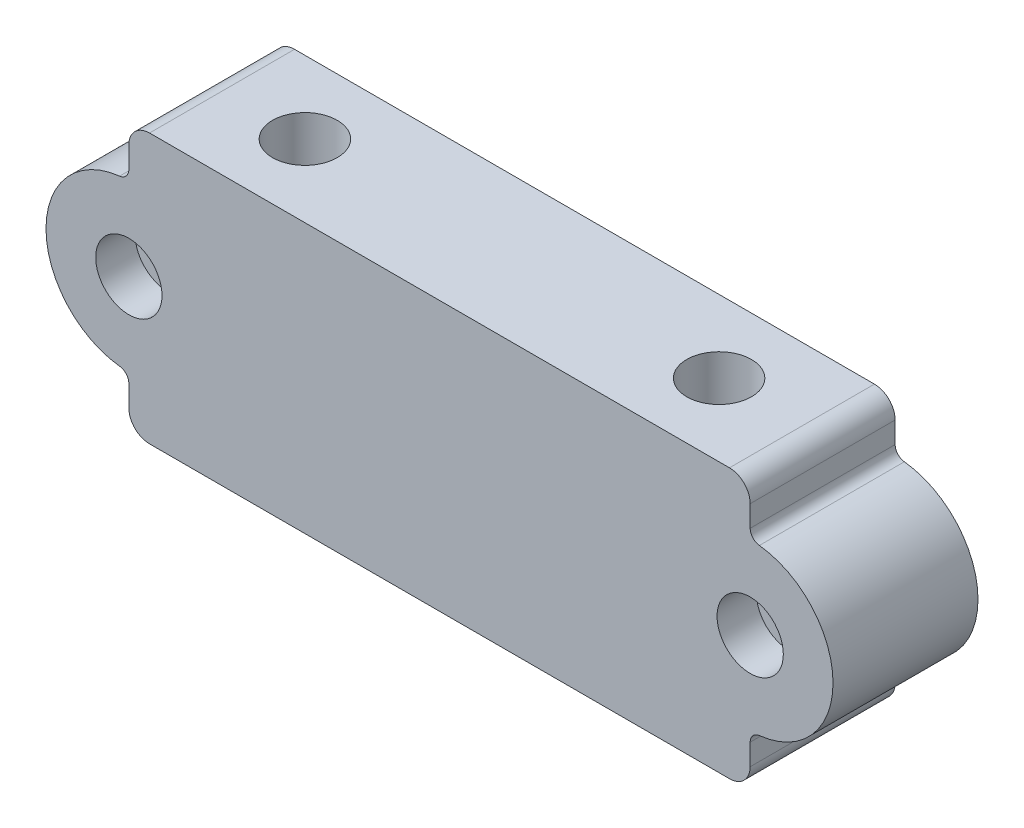
ISO-10303-21;
HEADER;
FILE_DESCRIPTION(('STEP AP214'),'2;1');
FILE_NAME('part.step','',(''),(''),'','','');
FILE_SCHEMA(('AUTOMOTIVE_DESIGN { 1 0 10303 214 1 1 1 1 }'));
ENDSEC;
DATA;
#1=APPLICATION_CONTEXT('core data for automotive mechanical design processes');
#2=APPLICATION_PROTOCOL_DEFINITION('international standard','automotive_design',2000,#1);
#3=PRODUCT_CONTEXT('',#1,'mechanical');
#4=PRODUCT('Part','Part','',(#3));
#5=PRODUCT_RELATED_PRODUCT_CATEGORY('part','',(#4));
#6=PRODUCT_DEFINITION_FORMATION('','',#4);
#7=PRODUCT_DEFINITION_CONTEXT('part definition',#1,'design');
#8=PRODUCT_DEFINITION('design','',#6,#7);
#9=PRODUCT_DEFINITION_SHAPE('','',#8);
#10=(LENGTH_UNIT() NAMED_UNIT(*) SI_UNIT(.MILLI.,.METRE.));
#11=(NAMED_UNIT(*) PLANE_ANGLE_UNIT() SI_UNIT($,.RADIAN.));
#12=(NAMED_UNIT(*) SI_UNIT($,.STERADIAN.) SOLID_ANGLE_UNIT());
#13=UNCERTAINTY_MEASURE_WITH_UNIT(LENGTH_MEASURE(1.E-05),#10,'distance_accuracy_value','');
#14=(GEOMETRIC_REPRESENTATION_CONTEXT(3) GLOBAL_UNCERTAINTY_ASSIGNED_CONTEXT((#13)) GLOBAL_UNIT_ASSIGNED_CONTEXT((#10,
#11,#12)) REPRESENTATION_CONTEXT('',''));
#15=CARTESIAN_POINT('',(0.,0.,0.));
#16=DIRECTION('',(0.,0.,1.));
#17=DIRECTION('',(1.,0.,0.));
#18=AXIS2_PLACEMENT_3D('',#15,#16,#17);
#19=CARTESIAN_POINT('',(101.6,-33.02,0.));
#20=DIRECTION('',(0.,0.,1.));
#21=DIRECTION('',(1.,0.,0.));
#22=AXIS2_PLACEMENT_3D('',#19,#20,#21);
#23=PLANE('',#22);
#24=CARTESIAN_POINT('',(88.9,-16.51,0.));
#25=DIRECTION('',(0.,0.,1.));
#26=DIRECTION('',(1.,0.,0.));
#27=AXIS2_PLACEMENT_3D('',#24,#25,#26);
#28=CIRCLE('',#27,4.064);
#29=CARTESIAN_POINT('',(92.964,-16.51,0.));
#30=VERTEX_POINT('',#29);
#31=EDGE_CURVE('E276',#30,#30,#28,.T.);
#32=ORIENTED_EDGE('',*,*,#31,.F.);
#33=EDGE_LOOP('',(#32));
#34=FACE_BOUND('',#33,.T.);
#35=CARTESIAN_POINT('',(12.7,-16.51,0.));
#36=DIRECTION('',(0.,0.,1.));
#37=DIRECTION('',(1.,0.,0.));
#38=AXIS2_PLACEMENT_3D('',#35,#36,#37);
#39=CIRCLE('',#38,4.064);
#40=CARTESIAN_POINT('',(16.764,-16.51,0.));
#41=VERTEX_POINT('',#40);
#42=EDGE_CURVE('E215',#41,#41,#39,.T.);
#43=ORIENTED_EDGE('',*,*,#42,.F.);
#44=EDGE_LOOP('',(#43));
#45=FACE_BOUND('',#44,.T.);
#46=DIRECTION('',(1.,0.,0.));
#47=VECTOR('',#46,1.);
#48=CARTESIAN_POINT('',(101.6,0.,0.));
#49=LINE('',#48,#47);
#50=CARTESIAN_POINT('',(15.24,0.,0.));
#51=VERTEX_POINT('',#50);
#52=CARTESIAN_POINT('',(86.36,0.,0.));
#53=VERTEX_POINT('',#52);
#54=EDGE_CURVE('E317',#51,#53,#49,.T.);
#55=ORIENTED_EDGE('',*,*,#54,.F.);
#56=CARTESIAN_POINT('',(15.24,-2.54,0.));
#57=DIRECTION('',(0.,0.,1.));
#58=DIRECTION('',(1.,0.,0.));
#59=AXIS2_PLACEMENT_3D('',#56,#57,#58);
#60=CIRCLE('',#59,2.54);
#61=CARTESIAN_POINT('',(12.7,-2.54,0.));
#62=VERTEX_POINT('',#61);
#63=EDGE_CURVE('E349',#51,#62,#60,.T.);
#64=ORIENTED_EDGE('',*,*,#63,.T.);
#65=DIRECTION('',(0.,1.,0.));
#66=VECTOR('',#65,1.);
#67=CARTESIAN_POINT('',(12.7,-5.15077467430091,0.));
#68=LINE('',#67,#66);
#69=CARTESIAN_POINT('',(12.7,-5.15077467430091,0.));
#70=VERTEX_POINT('',#69);
#71=EDGE_CURVE('E202',#70,#62,#68,.T.);
#72=ORIENTED_EDGE('',*,*,#71,.F.);
#73=CARTESIAN_POINT('',(11.43,-5.15077467430094,0.));
#74=DIRECTION('',(0.,0.,1.));
#75=DIRECTION('',(-1.,0.,0.));
#76=AXIS2_PLACEMENT_3D('',#73,#74,#75);
#77=CIRCLE('',#76,1.26999999999998);
#78=CARTESIAN_POINT('',(11.5711111111111,-6.41291082160079,0.));
#79=VERTEX_POINT('',#78);
#80=EDGE_CURVE('E165',#79,#70,#77,.T.);
#81=ORIENTED_EDGE('',*,*,#80,.F.);
#82=CARTESIAN_POINT('',(12.7,-16.5099999999999,0.));
#83=DIRECTION('',(0.,0.,-1.));
#84=DIRECTION('',(-1.,0.,0.));
#85=AXIS2_PLACEMENT_3D('',#82,#83,#84);
#86=CIRCLE('',#85,10.1600000000001);
#87=CARTESIAN_POINT('',(11.5711111111111,-26.607089178399,0.));
#88=VERTEX_POINT('',#87);
#89=EDGE_CURVE('E186',#88,#79,#86,.T.);
#90=ORIENTED_EDGE('',*,*,#89,.F.);
#91=CARTESIAN_POINT('',(11.43,-27.8692253256989,0.));
#92=DIRECTION('',(0.,0.,1.));
#93=DIRECTION('',(1.,0.,0.));
#94=AXIS2_PLACEMENT_3D('',#91,#92,#93);
#95=CIRCLE('',#94,1.27);
#96=CARTESIAN_POINT('',(12.7,-27.8692253256989,0.));
#97=VERTEX_POINT('',#96);
#98=EDGE_CURVE('E190',#97,#88,#95,.T.);
#99=ORIENTED_EDGE('',*,*,#98,.F.);
#100=DIRECTION('',(0.,1.,0.));
#101=VECTOR('',#100,1.);
#102=CARTESIAN_POINT('',(12.7,-27.8692253256989,0.));
#103=LINE('',#102,#101);
#104=CARTESIAN_POINT('',(12.7,-30.48,0.));
#105=VERTEX_POINT('',#104);
#106=EDGE_CURVE('E206',#105,#97,#103,.T.);
#107=ORIENTED_EDGE('',*,*,#106,.F.);
#108=CARTESIAN_POINT('',(15.24,-30.48,0.));
#109=DIRECTION('',(0.,0.,1.));
#110=DIRECTION('',(1.,0.,0.));
#111=AXIS2_PLACEMENT_3D('',#108,#109,#110);
#112=CIRCLE('',#111,2.54);
#113=CARTESIAN_POINT('',(15.24,-33.02,0.));
#114=VERTEX_POINT('',#113);
#115=EDGE_CURVE('E340',#105,#114,#112,.T.);
#116=ORIENTED_EDGE('',*,*,#115,.T.);
#117=DIRECTION('',(1.,0.,0.));
#118=VECTOR('',#117,1.);
#119=CARTESIAN_POINT('',(101.6,-33.02,0.));
#120=LINE('',#119,#118);
#121=CARTESIAN_POINT('',(86.36,-33.02,0.));
#122=VERTEX_POINT('',#121);
#123=EDGE_CURVE('E316',#114,#122,#120,.T.);
#124=ORIENTED_EDGE('',*,*,#123,.T.);
#125=CARTESIAN_POINT('',(86.36,-30.48,0.));
#126=DIRECTION('',(0.,0.,1.));
#127=DIRECTION('',(1.,0.,0.));
#128=AXIS2_PLACEMENT_3D('',#125,#126,#127);
#129=CIRCLE('',#128,2.54);
#130=CARTESIAN_POINT('',(88.9,-30.48,2.66050878019847E-13));
#131=VERTEX_POINT('',#130);
#132=EDGE_CURVE('E343',#122,#131,#129,.T.);
#133=ORIENTED_EDGE('',*,*,#132,.T.);
#134=DIRECTION('',(0.,-1.,0.));
#135=VECTOR('',#134,1.);
#136=CARTESIAN_POINT('',(88.9,-27.8692253256989,2.66050878019847E-13));
#137=LINE('',#136,#135);
#138=CARTESIAN_POINT('',(88.9,-27.8692253256989,2.66050878019847E-13));
#139=VERTEX_POINT('',#138);
#140=EDGE_CURVE('E254',#139,#131,#137,.T.);
#141=ORIENTED_EDGE('',*,*,#140,.F.);
#142=CARTESIAN_POINT('',(90.17,-27.8692253256989,2.74919240620508E-13));
#143=DIRECTION('',(0.,0.,1.));
#144=DIRECTION('',(-1.,0.,0.));
#145=AXIS2_PLACEMENT_3D('',#142,#143,#144);
#146=CIRCLE('',#145,1.27);
#147=CARTESIAN_POINT('',(90.0288888888889,-26.607089178399,2.73933866998212E-13));
#148=VERTEX_POINT('',#147);
#149=EDGE_CURVE('E250',#148,#139,#146,.T.);
#150=ORIENTED_EDGE('',*,*,#149,.F.);
#151=CARTESIAN_POINT('',(88.9,-16.5099999999999,2.66050878019847E-13));
#152=DIRECTION('',(0.,0.,-1.));
#153=DIRECTION('',(1.,0.,0.));
#154=AXIS2_PLACEMENT_3D('',#151,#152,#153);
#155=CIRCLE('',#154,10.1600000000001);
#156=CARTESIAN_POINT('',(90.0288888888889,-6.41291082160078,2.73933866998212E-13));
#157=VERTEX_POINT('',#156);
#158=EDGE_CURVE('E246',#157,#148,#155,.T.);
#159=ORIENTED_EDGE('',*,*,#158,.F.);
#160=CARTESIAN_POINT('',(90.17,-5.15077467430092,2.74919240620508E-13));
#161=DIRECTION('',(0.,0.,1.));
#162=DIRECTION('',(1.,0.,0.));
#163=AXIS2_PLACEMENT_3D('',#160,#161,#162);
#164=CIRCLE('',#163,1.26999999999998);
#165=CARTESIAN_POINT('',(88.9,-5.1507746743009,2.66050878019847E-13));
#166=VERTEX_POINT('',#165);
#167=EDGE_CURVE('E242',#166,#157,#164,.T.);
#168=ORIENTED_EDGE('',*,*,#167,.F.);
#169=DIRECTION('',(0.,-1.,0.));
#170=VECTOR('',#169,1.);
#171=CARTESIAN_POINT('',(88.9,-5.1507746743009,2.66050878019847E-13));
#172=LINE('',#171,#170);
#173=CARTESIAN_POINT('',(88.9,-2.54,2.66050878019847E-13));
#174=VERTEX_POINT('',#173);
#175=EDGE_CURVE('E227',#174,#166,#172,.T.);
#176=ORIENTED_EDGE('',*,*,#175,.F.);
#177=CARTESIAN_POINT('',(86.36,-2.54,0.));
#178=DIRECTION('',(0.,0.,1.));
#179=DIRECTION('',(1.,0.,0.));
#180=AXIS2_PLACEMENT_3D('',#177,#178,#179);
#181=CIRCLE('',#180,2.54);
#182=EDGE_CURVE('E346',#174,#53,#181,.T.);
#183=ORIENTED_EDGE('',*,*,#182,.T.);
#184=EDGE_LOOP('',(#55,#64,#72,#81,#90,#99,#107,#116,#124,#133,#141,#150,#159,#168,#176,#183));
#185=FACE_BOUND('',#184,.T.);
#186=ADVANCED_FACE('F42',(#34,#45,#185),#23,.T.);
#187=CARTESIAN_POINT('',(101.6,-33.02,-17.78));
#188=DIRECTION('',(0.,0.,-1.));
#189=DIRECTION('',(-1.,0.,0.));
#190=AXIS2_PLACEMENT_3D('',#187,#188,#189);
#191=PLANE('',#190);
#192=CARTESIAN_POINT('',(88.9,-16.51,-17.78));
#193=DIRECTION('',(0.,0.,-1.));
#194=DIRECTION('',(-1.,0.,0.));
#195=AXIS2_PLACEMENT_3D('',#192,#193,#194);
#196=CIRCLE('',#195,2.4892);
#197=CARTESIAN_POINT('',(86.4108,-16.51,-17.78));
#198=VERTEX_POINT('',#197);
#199=EDGE_CURVE('E287',#198,#198,#196,.F.);
#200=ORIENTED_EDGE('',*,*,#199,.T.);
#201=EDGE_LOOP('',(#200));
#202=FACE_BOUND('',#201,.T.);
#203=CARTESIAN_POINT('',(12.7,-16.51,-17.78));
#204=DIRECTION('',(0.,0.,-1.));
#205=DIRECTION('',(-1.,0.,0.));
#206=AXIS2_PLACEMENT_3D('',#203,#204,#205);
#207=CIRCLE('',#206,2.4892);
#208=CARTESIAN_POINT('',(10.2108,-16.51,-17.78));
#209=VERTEX_POINT('',#208);
#210=EDGE_CURVE('E292',#209,#209,#207,.F.);
#211=ORIENTED_EDGE('',*,*,#210,.T.);
#212=EDGE_LOOP('',(#211));
#213=FACE_BOUND('',#212,.T.);
#214=DIRECTION('',(0.,1.,0.));
#215=VECTOR('',#214,1.);
#216=CARTESIAN_POINT('',(12.7,-5.15077467430091,-17.78));
#217=LINE('',#216,#215);
#218=CARTESIAN_POINT('',(12.7,-5.15077467430091,-17.78));
#219=VERTEX_POINT('',#218);
#220=CARTESIAN_POINT('',(12.7,-2.54,-17.78));
#221=VERTEX_POINT('',#220);
#222=EDGE_CURVE('E174',#219,#221,#217,.T.);
#223=ORIENTED_EDGE('',*,*,#222,.T.);
#224=CARTESIAN_POINT('',(15.24,-2.54,-17.78));
#225=DIRECTION('',(0.,0.,-1.));
#226=DIRECTION('',(-1.,0.,0.));
#227=AXIS2_PLACEMENT_3D('',#224,#225,#226);
#228=CIRCLE('',#227,2.54);
#229=CARTESIAN_POINT('',(15.24,0.,-17.78));
#230=VERTEX_POINT('',#229);
#231=EDGE_CURVE('E362',#221,#230,#228,.T.);
#232=ORIENTED_EDGE('',*,*,#231,.T.);
#233=DIRECTION('',(-1.,0.,0.));
#234=VECTOR('',#233,1.);
#235=CARTESIAN_POINT('',(101.6,0.,-17.78));
#236=LINE('',#235,#234);
#237=CARTESIAN_POINT('',(86.36,0.,-17.78));
#238=VERTEX_POINT('',#237);
#239=EDGE_CURVE('E309',#238,#230,#236,.T.);
#240=ORIENTED_EDGE('',*,*,#239,.F.);
#241=CARTESIAN_POINT('',(86.36,-2.54,-17.78));
#242=DIRECTION('',(0.,0.,-1.));
#243=DIRECTION('',(-1.,0.,0.));
#244=AXIS2_PLACEMENT_3D('',#241,#242,#243);
#245=CIRCLE('',#244,2.54);
#246=CARTESIAN_POINT('',(88.9,-2.54,-17.7799999999997));
#247=VERTEX_POINT('',#246);
#248=EDGE_CURVE('E359',#238,#247,#245,.T.);
#249=ORIENTED_EDGE('',*,*,#248,.T.);
#250=DIRECTION('',(0.,-1.,0.));
#251=VECTOR('',#250,1.);
#252=CARTESIAN_POINT('',(88.9,-5.1507746743009,-17.7799999999997));
#253=LINE('',#252,#251);
#254=CARTESIAN_POINT('',(88.9,-5.1507746743009,-17.7799999999997));
#255=VERTEX_POINT('',#254);
#256=EDGE_CURVE('E238',#247,#255,#253,.T.);
#257=ORIENTED_EDGE('',*,*,#256,.T.);
#258=CARTESIAN_POINT('',(90.17,-5.15077467430092,-17.7799999999997));
#259=DIRECTION('',(0.,0.,1.));
#260=DIRECTION('',(1.,0.,0.));
#261=AXIS2_PLACEMENT_3D('',#258,#259,#260);
#262=CIRCLE('',#261,1.26999999999998);
#263=CARTESIAN_POINT('',(90.0288888888889,-6.41291082160078,-17.7799999999997));
#264=VERTEX_POINT('',#263);
#265=EDGE_CURVE('E222',#255,#264,#262,.T.);
#266=ORIENTED_EDGE('',*,*,#265,.T.);
#267=CARTESIAN_POINT('',(88.9,-16.5099999999999,-17.7799999999997));
#268=DIRECTION('',(0.,0.,-1.));
#269=DIRECTION('',(1.,0.,0.));
#270=AXIS2_PLACEMENT_3D('',#267,#268,#269);
#271=CIRCLE('',#270,10.1600000000001);
#272=CARTESIAN_POINT('',(90.0288888888889,-26.607089178399,-17.7799999999997));
#273=VERTEX_POINT('',#272);
#274=EDGE_CURVE('E226',#264,#273,#271,.T.);
#275=ORIENTED_EDGE('',*,*,#274,.T.);
#276=CARTESIAN_POINT('',(90.17,-27.8692253256989,-17.7799999999997));
#277=DIRECTION('',(0.,0.,1.));
#278=DIRECTION('',(-1.,0.,0.));
#279=AXIS2_PLACEMENT_3D('',#276,#277,#278);
#280=CIRCLE('',#279,1.27);
#281=CARTESIAN_POINT('',(88.9,-27.8692253256989,-17.7799999999997));
#282=VERTEX_POINT('',#281);
#283=EDGE_CURVE('E231',#273,#282,#280,.T.);
#284=ORIENTED_EDGE('',*,*,#283,.T.);
#285=DIRECTION('',(0.,-1.,0.));
#286=VECTOR('',#285,1.);
#287=CARTESIAN_POINT('',(88.9,-27.8692253256989,-17.7799999999997));
#288=LINE('',#287,#286);
#289=CARTESIAN_POINT('',(88.9,-30.48,-17.7799999999997));
#290=VERTEX_POINT('',#289);
#291=EDGE_CURVE('E235',#282,#290,#288,.T.);
#292=ORIENTED_EDGE('',*,*,#291,.T.);
#293=CARTESIAN_POINT('',(86.36,-30.48,-17.78));
#294=DIRECTION('',(0.,0.,-1.));
#295=DIRECTION('',(-1.,0.,0.));
#296=AXIS2_PLACEMENT_3D('',#293,#294,#295);
#297=CIRCLE('',#296,2.54);
#298=CARTESIAN_POINT('',(86.36,-33.02,-17.78));
#299=VERTEX_POINT('',#298);
#300=EDGE_CURVE('E65',#290,#299,#297,.T.);
#301=ORIENTED_EDGE('',*,*,#300,.T.);
#302=DIRECTION('',(-1.,0.,0.));
#303=VECTOR('',#302,1.);
#304=CARTESIAN_POINT('',(101.6,-33.02,-17.78));
#305=LINE('',#304,#303);
#306=CARTESIAN_POINT('',(15.24,-33.02,-17.78));
#307=VERTEX_POINT('',#306);
#308=EDGE_CURVE('E313',#299,#307,#305,.T.);
#309=ORIENTED_EDGE('',*,*,#308,.T.);
#310=CARTESIAN_POINT('',(15.24,-30.48,-17.78));
#311=DIRECTION('',(0.,0.,-1.));
#312=DIRECTION('',(-1.,0.,0.));
#313=AXIS2_PLACEMENT_3D('',#310,#311,#312);
#314=CIRCLE('',#313,2.54);
#315=CARTESIAN_POINT('',(12.7,-30.48,-17.78));
#316=VERTEX_POINT('',#315);
#317=EDGE_CURVE('E354',#307,#316,#314,.T.);
#318=ORIENTED_EDGE('',*,*,#317,.T.);
#319=DIRECTION('',(0.,1.,0.));
#320=VECTOR('',#319,1.);
#321=CARTESIAN_POINT('',(12.7,-27.8692253256989,-17.78));
#322=LINE('',#321,#320);
#323=CARTESIAN_POINT('',(12.7,-27.8692253256989,-17.78));
#324=VERTEX_POINT('',#323);
#325=EDGE_CURVE('E180',#316,#324,#322,.T.);
#326=ORIENTED_EDGE('',*,*,#325,.T.);
#327=CARTESIAN_POINT('',(11.43,-27.8692253256989,-17.78));
#328=DIRECTION('',(0.,0.,1.));
#329=DIRECTION('',(1.,0.,0.));
#330=AXIS2_PLACEMENT_3D('',#327,#328,#329);
#331=CIRCLE('',#330,1.27);
#332=CARTESIAN_POINT('',(11.5711111111111,-26.607089178399,-17.78));
#333=VERTEX_POINT('',#332);
#334=EDGE_CURVE('E195',#324,#333,#331,.T.);
#335=ORIENTED_EDGE('',*,*,#334,.T.);
#336=CARTESIAN_POINT('',(12.7,-16.5099999999999,-17.78));
#337=DIRECTION('',(0.,0.,-1.));
#338=DIRECTION('',(-1.,0.,0.));
#339=AXIS2_PLACEMENT_3D('',#336,#337,#338);
#340=CIRCLE('',#339,10.1600000000001);
#341=CARTESIAN_POINT('',(11.5711111111111,-6.41291082160079,-17.78));
#342=VERTEX_POINT('',#341);
#343=EDGE_CURVE('E171',#333,#342,#340,.T.);
#344=ORIENTED_EDGE('',*,*,#343,.T.);
#345=CARTESIAN_POINT('',(11.43,-5.15077467430094,-17.78));
#346=DIRECTION('',(0.,0.,1.));
#347=DIRECTION('',(-1.,0.,0.));
#348=AXIS2_PLACEMENT_3D('',#345,#346,#347);
#349=CIRCLE('',#348,1.26999999999998);
#350=EDGE_CURVE('E162',#342,#219,#349,.T.);
#351=ORIENTED_EDGE('',*,*,#350,.T.);
#352=EDGE_LOOP('',(#223,#232,#240,#249,#257,#266,#275,#284,#292,#301,#309,#318,#326,#335,#344,#351));
#353=FACE_BOUND('',#352,.T.);
#354=ADVANCED_FACE('F182',(#202,#213,#353),#191,.T.);
#355=CARTESIAN_POINT('',(12.7,-16.51,-24.8205207989182));
#356=DIRECTION('',(0.,0.,1.));
#357=DIRECTION('',(1.,0.,0.));
#358=AXIS2_PLACEMENT_3D('',#355,#356,#357);
#359=CYLINDRICAL_SURFACE('',#358,2.4892);
#360=ORIENTED_EDGE('',*,*,#210,.F.);
#361=EDGE_LOOP('',(#360));
#362=FACE_BOUND('',#361,.T.);
#363=CARTESIAN_POINT('',(12.7,-16.51,-4.826));
#364=DIRECTION('',(0.,0.,1.));
#365=DIRECTION('',(1.,0.,0.));
#366=AXIS2_PLACEMENT_3D('',#363,#364,#365);
#367=CIRCLE('',#366,2.4892);
#368=CARTESIAN_POINT('',(15.1892,-16.51,-4.826));
#369=VERTEX_POINT('',#368);
#370=EDGE_CURVE('E296',#369,#369,#367,.F.);
#371=ORIENTED_EDGE('',*,*,#370,.F.);
#372=EDGE_LOOP('',(#371));
#373=FACE_BOUND('',#372,.T.);
#374=ADVANCED_FACE('F444',(#362,#373),#359,.F.);
#375=CARTESIAN_POINT('',(88.9,-16.51,-24.8205207989182));
#376=DIRECTION('',(0.,0.,1.));
#377=DIRECTION('',(1.,0.,0.));
#378=AXIS2_PLACEMENT_3D('',#375,#376,#377);
#379=CYLINDRICAL_SURFACE('',#378,2.4892);
#380=ORIENTED_EDGE('',*,*,#199,.F.);
#381=EDGE_LOOP('',(#380));
#382=FACE_BOUND('',#381,.T.);
#383=CARTESIAN_POINT('',(88.9,-16.51,-4.826));
#384=DIRECTION('',(0.,0.,1.));
#385=DIRECTION('',(1.,0.,0.));
#386=AXIS2_PLACEMENT_3D('',#383,#384,#385);
#387=CIRCLE('',#386,2.4892);
#388=CARTESIAN_POINT('',(91.3892,-16.51,-4.826));
#389=VERTEX_POINT('',#388);
#390=EDGE_CURVE('E275',#389,#389,#387,.F.);
#391=ORIENTED_EDGE('',*,*,#390,.F.);
#392=EDGE_LOOP('',(#391));
#393=FACE_BOUND('',#392,.T.);
#394=ADVANCED_FACE('F533',(#382,#393),#379,.F.);
#395=CARTESIAN_POINT('',(0.,-33.02,0.));
#396=DIRECTION('',(0.,-1.,0.));
#397=DIRECTION('',(0.,0.,-1.));
#398=AXIS2_PLACEMENT_3D('',#395,#396,#397);
#399=PLANE('',#398);
#400=ORIENTED_EDGE('',*,*,#308,.F.);
#401=DIRECTION('',(0.,0.,1.));
#402=VECTOR('',#401,1.);
#403=CARTESIAN_POINT('',(86.36,-33.02,2.66050878019847E-13));
#404=LINE('',#403,#402);
#405=EDGE_CURVE('E371',#299,#122,#404,.T.);
#406=ORIENTED_EDGE('',*,*,#405,.T.);
#407=ORIENTED_EDGE('',*,*,#123,.F.);
#408=DIRECTION('',(0.,0.,1.));
#409=VECTOR('',#408,1.);
#410=CARTESIAN_POINT('',(15.24,-33.02,-17.78));
#411=LINE('',#410,#409);
#412=EDGE_CURVE('E58',#114,#307,#411,.F.);
#413=ORIENTED_EDGE('',*,*,#412,.T.);
#414=EDGE_LOOP('',(#400,#406,#407,#413));
#415=FACE_BOUND('',#414,.T.);
#416=CARTESIAN_POINT('',(25.4,-33.02,-8.88999999999997));
#417=DIRECTION('',(0.,1.,0.));
#418=DIRECTION('',(0.,0.,1.));
#419=AXIS2_PLACEMENT_3D('',#416,#417,#418);
#420=CIRCLE('',#419,3.96874999999999);
#421=CARTESIAN_POINT('',(25.4,-33.02,-4.92124999999998));
#422=VERTEX_POINT('',#421);
#423=EDGE_CURVE('E297',#422,#422,#420,.T.);
#424=ORIENTED_EDGE('',*,*,#423,.T.);
#425=EDGE_LOOP('',(#424));
#426=FACE_BOUND('',#425,.T.);
#427=CARTESIAN_POINT('',(76.2,-33.02,-8.88999999999997));
#428=DIRECTION('',(0.,1.,0.));
#429=DIRECTION('',(0.,0.,1.));
#430=AXIS2_PLACEMENT_3D('',#427,#428,#429);
#431=CIRCLE('',#430,3.96875);
#432=CARTESIAN_POINT('',(76.2,-33.02,-4.92124999999997));
#433=VERTEX_POINT('',#432);
#434=EDGE_CURVE('E305',#433,#433,#431,.T.);
#435=ORIENTED_EDGE('',*,*,#434,.T.);
#436=EDGE_LOOP('',(#435));
#437=FACE_BOUND('',#436,.T.);
#438=ADVANCED_FACE('F384',(#415,#426,#437),#399,.T.);
#439=CARTESIAN_POINT('',(0.,0.,0.));
#440=DIRECTION('',(0.,-1.,0.));
#441=DIRECTION('',(0.,0.,-1.));
#442=AXIS2_PLACEMENT_3D('',#439,#440,#441);
#443=PLANE('',#442);
#444=CARTESIAN_POINT('',(25.4,0.,-8.88999999999997));
#445=DIRECTION('',(0.,1.,0.));
#446=DIRECTION('',(0.,0.,1.));
#447=AXIS2_PLACEMENT_3D('',#444,#445,#446);
#448=CIRCLE('',#447,3.96874999999999);
#449=CARTESIAN_POINT('',(25.4,0.,-4.92124999999998));
#450=VERTEX_POINT('',#449);
#451=EDGE_CURVE('E291',#450,#450,#448,.T.);
#452=ORIENTED_EDGE('',*,*,#451,.F.);
#453=EDGE_LOOP('',(#452));
#454=FACE_BOUND('',#453,.T.);
#455=CARTESIAN_POINT('',(76.2,0.,-8.88999999999997));
#456=DIRECTION('',(0.,1.,0.));
#457=DIRECTION('',(0.,0.,1.));
#458=AXIS2_PLACEMENT_3D('',#455,#456,#457);
#459=CIRCLE('',#458,3.96875);
#460=CARTESIAN_POINT('',(76.2,0.,-4.92124999999997));
#461=VERTEX_POINT('',#460);
#462=EDGE_CURVE('E301',#461,#461,#459,.T.);
#463=ORIENTED_EDGE('',*,*,#462,.F.);
#464=EDGE_LOOP('',(#463));
#465=FACE_BOUND('',#464,.T.);
#466=ORIENTED_EDGE('',*,*,#239,.T.);
#467=DIRECTION('',(0.,0.,1.));
#468=VECTOR('',#467,1.);
#469=CARTESIAN_POINT('',(15.24,0.,0.));
#470=LINE('',#469,#468);
#471=EDGE_CURVE('E336',#230,#51,#470,.T.);
#472=ORIENTED_EDGE('',*,*,#471,.T.);
#473=ORIENTED_EDGE('',*,*,#54,.T.);
#474=DIRECTION('',(0.,0.,1.));
#475=VECTOR('',#474,1.);
#476=CARTESIAN_POINT('',(86.36,0.,0.));
#477=LINE('',#476,#475);
#478=EDGE_CURVE('E321',#53,#238,#477,.F.);
#479=ORIENTED_EDGE('',*,*,#478,.T.);
#480=EDGE_LOOP('',(#466,#472,#473,#479));
#481=FACE_BOUND('',#480,.T.);
#482=ADVANCED_FACE('F409',(#454,#465,#481),#443,.F.);
#483=CARTESIAN_POINT('',(76.2,-33.02,-8.88999999999997));
#484=DIRECTION('',(0.,1.,0.));
#485=DIRECTION('',(0.,0.,1.));
#486=AXIS2_PLACEMENT_3D('',#483,#484,#485);
#487=CYLINDRICAL_SURFACE('',#486,3.96875);
#488=ORIENTED_EDGE('',*,*,#434,.F.);
#489=EDGE_LOOP('',(#488));
#490=FACE_BOUND('',#489,.T.);
#491=ORIENTED_EDGE('',*,*,#462,.T.);
#492=EDGE_LOOP('',(#491));
#493=FACE_BOUND('',#492,.T.);
#494=ADVANCED_FACE('F522',(#490,#493),#487,.F.);
#495=CARTESIAN_POINT('',(25.4,-33.02,-8.88999999999997));
#496=DIRECTION('',(0.,1.,0.));
#497=DIRECTION('',(0.,0.,1.));
#498=AXIS2_PLACEMENT_3D('',#495,#496,#497);
#499=CYLINDRICAL_SURFACE('',#498,3.96874999999999);
#500=ORIENTED_EDGE('',*,*,#423,.F.);
#501=EDGE_LOOP('',(#500));
#502=FACE_BOUND('',#501,.T.);
#503=ORIENTED_EDGE('',*,*,#451,.T.);
#504=EDGE_LOOP('',(#503));
#505=FACE_BOUND('',#504,.T.);
#506=ADVANCED_FACE('F621',(#502,#505),#499,.F.);
#507=CARTESIAN_POINT('',(88.9,-16.51,-4.826));
#508=DIRECTION('',(0.,0.,1.));
#509=DIRECTION('',(1.,0.,0.));
#510=AXIS2_PLACEMENT_3D('',#507,#508,#509);
#511=PLANE('',#510);
#512=CARTESIAN_POINT('',(88.9,-16.51,-4.826));
#513=DIRECTION('',(0.,0.,1.));
#514=DIRECTION('',(1.,0.,0.));
#515=AXIS2_PLACEMENT_3D('',#512,#513,#514);
#516=CIRCLE('',#515,4.064);
#517=CARTESIAN_POINT('',(92.964,-16.51,-4.826));
#518=VERTEX_POINT('',#517);
#519=EDGE_CURVE('E271',#518,#518,#516,.T.);
#520=ORIENTED_EDGE('',*,*,#519,.T.);
#521=EDGE_LOOP('',(#520));
#522=FACE_BOUND('',#521,.T.);
#523=ORIENTED_EDGE('',*,*,#390,.T.);
#524=EDGE_LOOP('',(#523));
#525=FACE_BOUND('',#524,.T.);
#526=ADVANCED_FACE('F611',(#522,#525),#511,.T.);
#527=CARTESIAN_POINT('',(88.9,-16.51,-4.826));
#528=DIRECTION('',(0.,0.,1.));
#529=DIRECTION('',(1.,0.,0.));
#530=AXIS2_PLACEMENT_3D('',#527,#528,#529);
#531=CYLINDRICAL_SURFACE('',#530,4.064);
#532=ORIENTED_EDGE('',*,*,#519,.F.);
#533=EDGE_LOOP('',(#532));
#534=FACE_BOUND('',#533,.T.);
#535=ORIENTED_EDGE('',*,*,#31,.T.);
#536=EDGE_LOOP('',(#535));
#537=FACE_BOUND('',#536,.T.);
#538=ADVANCED_FACE('F601',(#534,#537),#531,.F.);
#539=CARTESIAN_POINT('',(12.7,-16.51,-4.826));
#540=DIRECTION('',(0.,0.,1.));
#541=DIRECTION('',(1.,0.,0.));
#542=AXIS2_PLACEMENT_3D('',#539,#540,#541);
#543=PLANE('',#542);
#544=CARTESIAN_POINT('',(12.7,-16.51,-4.826));
#545=DIRECTION('',(0.,0.,1.));
#546=DIRECTION('',(1.,0.,0.));
#547=AXIS2_PLACEMENT_3D('',#544,#545,#546);
#548=CIRCLE('',#547,4.064);
#549=CARTESIAN_POINT('',(16.764,-16.51,-4.826));
#550=VERTEX_POINT('',#549);
#551=EDGE_CURVE('E280',#550,#550,#548,.T.);
#552=ORIENTED_EDGE('',*,*,#551,.T.);
#553=EDGE_LOOP('',(#552));
#554=FACE_BOUND('',#553,.T.);
#555=ORIENTED_EDGE('',*,*,#370,.T.);
#556=EDGE_LOOP('',(#555));
#557=FACE_BOUND('',#556,.T.);
#558=ADVANCED_FACE('F591',(#554,#557),#543,.T.);
#559=CARTESIAN_POINT('',(12.7,-16.51,-4.826));
#560=DIRECTION('',(0.,0.,1.));
#561=DIRECTION('',(1.,0.,0.));
#562=AXIS2_PLACEMENT_3D('',#559,#560,#561);
#563=CYLINDRICAL_SURFACE('',#562,4.064);
#564=ORIENTED_EDGE('',*,*,#551,.F.);
#565=EDGE_LOOP('',(#564));
#566=FACE_BOUND('',#565,.T.);
#567=ORIENTED_EDGE('',*,*,#42,.T.);
#568=EDGE_LOOP('',(#567));
#569=FACE_BOUND('',#568,.T.);
#570=ADVANCED_FACE('F583',(#566,#569),#563,.F.);
#571=CARTESIAN_POINT('',(90.17,-5.15077467430092,-17.7799999999997));
#572=DIRECTION('',(0.,0.,1.));
#573=DIRECTION('',(1.,0.,0.));
#574=AXIS2_PLACEMENT_3D('',#571,#572,#573);
#575=CYLINDRICAL_SURFACE('',#574,1.26999999999998);
#576=ORIENTED_EDGE('',*,*,#167,.T.);
#577=DIRECTION('',(0.,0.,1.));
#578=VECTOR('',#577,1.);
#579=CARTESIAN_POINT('',(90.0288888888889,-6.41291082160078,-17.7799999999997));
#580=LINE('',#579,#578);
#581=EDGE_CURVE('E241',#264,#157,#580,.T.);
#582=ORIENTED_EDGE('',*,*,#581,.F.);
#583=ORIENTED_EDGE('',*,*,#265,.F.);
#584=DIRECTION('',(0.,0.,1.));
#585=VECTOR('',#584,1.);
#586=CARTESIAN_POINT('',(88.9,-5.1507746743009,-17.7799999999997));
#587=LINE('',#586,#585);
#588=EDGE_CURVE('E203',#255,#166,#587,.T.);
#589=ORIENTED_EDGE('',*,*,#588,.T.);
#590=EDGE_LOOP('',(#576,#582,#583,#589));
#591=FACE_BOUND('',#590,.T.);
#592=ADVANCED_FACE('F422',(#591),#575,.F.);
#593=CARTESIAN_POINT('',(88.9,-5.1507746743009,-17.7799999999997));
#594=DIRECTION('',(-1.,0.,0.));
#595=DIRECTION('',(0.,0.,1.));
#596=AXIS2_PLACEMENT_3D('',#593,#594,#595);
#597=PLANE('',#596);
#598=ORIENTED_EDGE('',*,*,#256,.F.);
#599=DIRECTION('',(0.,0.,1.));
#600=VECTOR('',#599,1.);
#601=CARTESIAN_POINT('',(88.9,-2.54,-17.7799999999997));
#602=LINE('',#601,#600);
#603=EDGE_CURVE('E365',#247,#174,#602,.T.);
#604=ORIENTED_EDGE('',*,*,#603,.T.);
#605=ORIENTED_EDGE('',*,*,#175,.T.);
#606=ORIENTED_EDGE('',*,*,#588,.F.);
#607=EDGE_LOOP('',(#598,#604,#605,#606));
#608=FACE_BOUND('',#607,.T.);
#609=ADVANCED_FACE('F417',(#608),#597,.F.);
#610=CARTESIAN_POINT('',(88.9,-27.8692253256989,-17.7799999999997));
#611=DIRECTION('',(-1.,0.,0.));
#612=DIRECTION('',(0.,0.,1.));
#613=AXIS2_PLACEMENT_3D('',#610,#611,#612);
#614=PLANE('',#613);
#615=ORIENTED_EDGE('',*,*,#140,.T.);
#616=DIRECTION('',(0.,0.,1.));
#617=VECTOR('',#616,1.);
#618=CARTESIAN_POINT('',(88.9,-30.48,-17.7799999999997));
#619=LINE('',#618,#617);
#620=EDGE_CURVE('E51',#131,#290,#619,.F.);
#621=ORIENTED_EDGE('',*,*,#620,.T.);
#622=ORIENTED_EDGE('',*,*,#291,.F.);
#623=DIRECTION('',(0.,0.,1.));
#624=VECTOR('',#623,1.);
#625=CARTESIAN_POINT('',(88.9,-27.8692253256989,-17.7799999999997));
#626=LINE('',#625,#624);
#627=EDGE_CURVE('E263',#282,#139,#626,.T.);
#628=ORIENTED_EDGE('',*,*,#627,.T.);
#629=EDGE_LOOP('',(#615,#621,#622,#628));
#630=FACE_BOUND('',#629,.T.);
#631=ADVANCED_FACE('F378',(#630),#614,.F.);
#632=CARTESIAN_POINT('',(90.17,-27.8692253256989,-17.7799999999997));
#633=DIRECTION('',(0.,0.,1.));
#634=DIRECTION('',(1.,0.,0.));
#635=AXIS2_PLACEMENT_3D('',#632,#633,#634);
#636=CYLINDRICAL_SURFACE('',#635,1.27);
#637=ORIENTED_EDGE('',*,*,#149,.T.);
#638=ORIENTED_EDGE('',*,*,#627,.F.);
#639=ORIENTED_EDGE('',*,*,#283,.F.);
#640=DIRECTION('',(0.,0.,1.));
#641=VECTOR('',#640,1.);
#642=CARTESIAN_POINT('',(90.0288888888889,-26.607089178399,-17.7799999999997));
#643=LINE('',#642,#641);
#644=EDGE_CURVE('E266',#273,#148,#643,.T.);
#645=ORIENTED_EDGE('',*,*,#644,.T.);
#646=EDGE_LOOP('',(#637,#638,#639,#645));
#647=FACE_BOUND('',#646,.T.);
#648=ADVANCED_FACE('F429',(#647),#636,.F.);
#649=CARTESIAN_POINT('',(88.9,-16.5099999999999,-17.7799999999997));
#650=DIRECTION('',(0.,0.,1.));
#651=DIRECTION('',(1.,0.,0.));
#652=AXIS2_PLACEMENT_3D('',#649,#650,#651);
#653=CYLINDRICAL_SURFACE('',#652,10.1600000000001);
#654=ORIENTED_EDGE('',*,*,#158,.T.);
#655=ORIENTED_EDGE('',*,*,#644,.F.);
#656=ORIENTED_EDGE('',*,*,#274,.F.);
#657=ORIENTED_EDGE('',*,*,#581,.T.);
#658=EDGE_LOOP('',(#654,#655,#656,#657));
#659=FACE_BOUND('',#658,.T.);
#660=ADVANCED_FACE('F425',(#659),#653,.T.);
#661=CARTESIAN_POINT('',(11.43,-5.15077467430094,-17.78));
#662=DIRECTION('',(0.,0.,1.));
#663=DIRECTION('',(1.,0.,0.));
#664=AXIS2_PLACEMENT_3D('',#661,#662,#663);
#665=CYLINDRICAL_SURFACE('',#664,1.26999999999998);
#666=ORIENTED_EDGE('',*,*,#80,.T.);
#667=DIRECTION('',(0.,0.,1.));
#668=VECTOR('',#667,1.);
#669=CARTESIAN_POINT('',(12.7,-5.15077467430091,-17.78));
#670=LINE('',#669,#668);
#671=EDGE_CURVE('E158',#219,#70,#670,.T.);
#672=ORIENTED_EDGE('',*,*,#671,.F.);
#673=ORIENTED_EDGE('',*,*,#350,.F.);
#674=DIRECTION('',(0.,0.,1.));
#675=VECTOR('',#674,1.);
#676=CARTESIAN_POINT('',(11.5711111111111,-6.41291082160079,-17.78));
#677=LINE('',#676,#675);
#678=EDGE_CURVE('E212',#342,#79,#677,.T.);
#679=ORIENTED_EDGE('',*,*,#678,.T.);
#680=EDGE_LOOP('',(#666,#672,#673,#679));
#681=FACE_BOUND('',#680,.T.);
#682=ADVANCED_FACE('F160',(#681),#665,.F.);
#683=CARTESIAN_POINT('',(12.7,-16.5099999999999,-17.78));
#684=DIRECTION('',(0.,0.,1.));
#685=DIRECTION('',(1.,0.,0.));
#686=AXIS2_PLACEMENT_3D('',#683,#684,#685);
#687=CYLINDRICAL_SURFACE('',#686,10.1600000000001);
#688=ORIENTED_EDGE('',*,*,#89,.T.);
#689=ORIENTED_EDGE('',*,*,#678,.F.);
#690=ORIENTED_EDGE('',*,*,#343,.F.);
#691=DIRECTION('',(0.,0.,1.));
#692=VECTOR('',#691,1.);
#693=CARTESIAN_POINT('',(11.5711111111111,-26.607089178399,-17.78));
#694=LINE('',#693,#692);
#695=EDGE_CURVE('E216',#333,#88,#694,.T.);
#696=ORIENTED_EDGE('',*,*,#695,.T.);
#697=EDGE_LOOP('',(#688,#689,#690,#696));
#698=FACE_BOUND('',#697,.T.);
#699=ADVANCED_FACE('F402',(#698),#687,.T.);
#700=CARTESIAN_POINT('',(11.43,-27.8692253256989,-17.78));
#701=DIRECTION('',(0.,0.,1.));
#702=DIRECTION('',(1.,0.,0.));
#703=AXIS2_PLACEMENT_3D('',#700,#701,#702);
#704=CYLINDRICAL_SURFACE('',#703,1.27);
#705=ORIENTED_EDGE('',*,*,#98,.T.);
#706=ORIENTED_EDGE('',*,*,#695,.F.);
#707=ORIENTED_EDGE('',*,*,#334,.F.);
#708=DIRECTION('',(0.,0.,1.));
#709=VECTOR('',#708,1.);
#710=CARTESIAN_POINT('',(12.7,-27.8692253256989,-17.78));
#711=LINE('',#710,#709);
#712=EDGE_CURVE('E170',#324,#97,#711,.T.);
#713=ORIENTED_EDGE('',*,*,#712,.T.);
#714=EDGE_LOOP('',(#705,#706,#707,#713));
#715=FACE_BOUND('',#714,.T.);
#716=ADVANCED_FACE('F399',(#715),#704,.F.);
#717=CARTESIAN_POINT('',(12.7,-27.8692253256989,-17.78));
#718=DIRECTION('',(1.,0.,0.));
#719=DIRECTION('',(0.,0.,-1.));
#720=AXIS2_PLACEMENT_3D('',#717,#718,#719);
#721=PLANE('',#720);
#722=ORIENTED_EDGE('',*,*,#325,.F.);
#723=DIRECTION('',(0.,0.,1.));
#724=VECTOR('',#723,1.);
#725=CARTESIAN_POINT('',(12.7,-30.48,0.));
#726=LINE('',#725,#724);
#727=EDGE_CURVE('E11',#316,#105,#726,.T.);
#728=ORIENTED_EDGE('',*,*,#727,.T.);
#729=ORIENTED_EDGE('',*,*,#106,.T.);
#730=ORIENTED_EDGE('',*,*,#712,.F.);
#731=EDGE_LOOP('',(#722,#728,#729,#730));
#732=FACE_BOUND('',#731,.T.);
#733=ADVANCED_FACE('F395',(#732),#721,.F.);
#734=CARTESIAN_POINT('',(12.7,-5.15077467430091,-17.78));
#735=DIRECTION('',(1.,0.,0.));
#736=DIRECTION('',(0.,0.,-1.));
#737=AXIS2_PLACEMENT_3D('',#734,#735,#736);
#738=PLANE('',#737);
#739=ORIENTED_EDGE('',*,*,#71,.T.);
#740=DIRECTION('',(0.,0.,1.));
#741=VECTOR('',#740,1.);
#742=CARTESIAN_POINT('',(12.7,-2.54,-17.78));
#743=LINE('',#742,#741);
#744=EDGE_CURVE('E177',#62,#221,#743,.F.);
#745=ORIENTED_EDGE('',*,*,#744,.T.);
#746=ORIENTED_EDGE('',*,*,#222,.F.);
#747=ORIENTED_EDGE('',*,*,#671,.T.);
#748=EDGE_LOOP('',(#739,#745,#746,#747));
#749=FACE_BOUND('',#748,.T.);
#750=ADVANCED_FACE('F175',(#749),#738,.F.);
#751=CARTESIAN_POINT('',(15.24,-2.54,0.));
#752=DIRECTION('',(0.,0.,1.));
#753=DIRECTION('',(1.,0.,0.));
#754=AXIS2_PLACEMENT_3D('',#751,#752,#753);
#755=CYLINDRICAL_SURFACE('',#754,2.54);
#756=ORIENTED_EDGE('',*,*,#231,.F.);
#757=ORIENTED_EDGE('',*,*,#744,.F.);
#758=ORIENTED_EDGE('',*,*,#63,.F.);
#759=ORIENTED_EDGE('',*,*,#471,.F.);
#760=EDGE_LOOP('',(#756,#757,#758,#759));
#761=FACE_BOUND('',#760,.T.);
#762=ADVANCED_FACE('F404',(#761),#755,.T.);
#763=CARTESIAN_POINT('',(86.36,-2.54,-17.7799999999997));
#764=DIRECTION('',(0.,0.,1.));
#765=DIRECTION('',(1.,0.,0.));
#766=AXIS2_PLACEMENT_3D('',#763,#764,#765);
#767=CYLINDRICAL_SURFACE('',#766,2.54);
#768=ORIENTED_EDGE('',*,*,#248,.F.);
#769=ORIENTED_EDGE('',*,*,#478,.F.);
#770=ORIENTED_EDGE('',*,*,#182,.F.);
#771=ORIENTED_EDGE('',*,*,#603,.F.);
#772=EDGE_LOOP('',(#768,#769,#770,#771));
#773=FACE_BOUND('',#772,.T.);
#774=ADVANCED_FACE('F412',(#773),#767,.T.);
#775=CARTESIAN_POINT('',(86.36,-30.48,0.));
#776=DIRECTION('',(0.,0.,-1.));
#777=DIRECTION('',(-1.,0.,0.));
#778=AXIS2_PLACEMENT_3D('',#775,#776,#777);
#779=CYLINDRICAL_SURFACE('',#778,2.54);
#780=ORIENTED_EDGE('',*,*,#300,.F.);
#781=ORIENTED_EDGE('',*,*,#620,.F.);
#782=ORIENTED_EDGE('',*,*,#132,.F.);
#783=ORIENTED_EDGE('',*,*,#405,.F.);
#784=EDGE_LOOP('',(#780,#781,#782,#783));
#785=FACE_BOUND('',#784,.T.);
#786=ADVANCED_FACE('F383',(#785),#779,.T.);
#787=CARTESIAN_POINT('',(15.24,-30.48,-17.78));
#788=DIRECTION('',(0.,0.,-1.));
#789=DIRECTION('',(-1.,0.,0.));
#790=AXIS2_PLACEMENT_3D('',#787,#788,#789);
#791=CYLINDRICAL_SURFACE('',#790,2.54);
#792=ORIENTED_EDGE('',*,*,#317,.F.);
#793=ORIENTED_EDGE('',*,*,#412,.F.);
#794=ORIENTED_EDGE('',*,*,#115,.F.);
#795=ORIENTED_EDGE('',*,*,#727,.F.);
#796=EDGE_LOOP('',(#792,#793,#794,#795));
#797=FACE_BOUND('',#796,.T.);
#798=ADVANCED_FACE('F44',(#797),#791,.T.);
#799=CLOSED_SHELL('',(#186,#354,#374,#394,#438,#482,#494,#506,#526,#538,#558,#570,#592,#609,
#631,#648,#660,#682,#699,#716,#733,#750,#762,#774,#786,#798));
#800=MANIFOLD_SOLID_BREP('B2',#799);
#801=ADVANCED_BREP_SHAPE_REPRESENTATION('',(#18,#800),#14);
#802=SHAPE_DEFINITION_REPRESENTATION(#9,#801);
ENDSEC;
END-ISO-10303-21;
